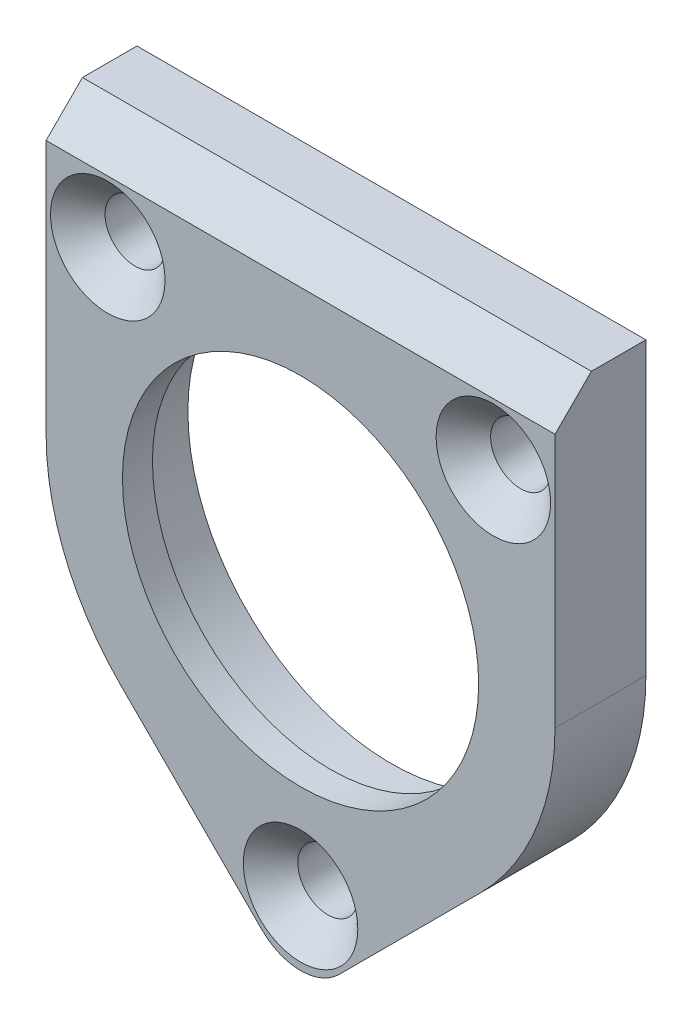
ISO-10303-21;
HEADER;
FILE_DESCRIPTION(('STEP AP214'),'2;1');
FILE_NAME('part.step','',(''),(''),'','','');
FILE_SCHEMA(('AUTOMOTIVE_DESIGN { 1 0 10303 214 1 1 1 1 }'));
ENDSEC;
DATA;
#1=APPLICATION_CONTEXT('core data for automotive mechanical design processes');
#2=APPLICATION_PROTOCOL_DEFINITION('international standard','automotive_design',2000,#1);
#3=PRODUCT_CONTEXT('',#1,'mechanical');
#4=PRODUCT('Part','Part','',(#3));
#5=PRODUCT_RELATED_PRODUCT_CATEGORY('part','',(#4));
#6=PRODUCT_DEFINITION_FORMATION('','',#4);
#7=PRODUCT_DEFINITION_CONTEXT('part definition',#1,'design');
#8=PRODUCT_DEFINITION('design','',#6,#7);
#9=PRODUCT_DEFINITION_SHAPE('','',#8);
#10=(LENGTH_UNIT() NAMED_UNIT(*) SI_UNIT(.MILLI.,.METRE.));
#11=(NAMED_UNIT(*) PLANE_ANGLE_UNIT() SI_UNIT($,.RADIAN.));
#12=(NAMED_UNIT(*) SI_UNIT($,.STERADIAN.) SOLID_ANGLE_UNIT());
#13=UNCERTAINTY_MEASURE_WITH_UNIT(LENGTH_MEASURE(1.E-05),#10,'distance_accuracy_value','');
#14=(GEOMETRIC_REPRESENTATION_CONTEXT(3) GLOBAL_UNCERTAINTY_ASSIGNED_CONTEXT((#13)) GLOBAL_UNIT_ASSIGNED_CONTEXT((#10,
#11,#12)) REPRESENTATION_CONTEXT('',''));
#15=CARTESIAN_POINT('',(0.,0.,0.));
#16=DIRECTION('',(0.,0.,1.));
#17=DIRECTION('',(1.,0.,0.));
#18=AXIS2_PLACEMENT_3D('',#15,#16,#17);
#19=CARTESIAN_POINT('',(-14.,14.,-5.));
#20=DIRECTION('',(-1.,0.,0.));
#21=DIRECTION('',(0.,0.,1.));
#22=AXIS2_PLACEMENT_3D('',#19,#20,#21);
#23=PLANE('',#22);
#24=DIRECTION('',(0.,-1.,0.));
#25=VECTOR('',#24,1.);
#26=CARTESIAN_POINT('',(-14.,14.,0.));
#27=LINE('',#26,#25);
#28=CARTESIAN_POINT('',(-14.,14.,0.));
#29=VERTEX_POINT('',#28);
#30=CARTESIAN_POINT('',(-14.,0.,0.));
#31=VERTEX_POINT('',#30);
#32=EDGE_CURVE('E150',#29,#31,#27,.T.);
#33=ORIENTED_EDGE('',*,*,#32,.F.);
#34=DIRECTION('',(0.,-0.707106781186547,0.707106781186548));
#35=VECTOR('',#34,1.);
#36=CARTESIAN_POINT('',(-14.,16.,-2.));
#37=LINE('',#36,#35);
#38=CARTESIAN_POINT('',(-14.,16.,-2.));
#39=VERTEX_POINT('',#38);
#40=EDGE_CURVE('E358',#39,#29,#37,.T.);
#41=ORIENTED_EDGE('',*,*,#40,.F.);
#42=DIRECTION('',(0.,0.,1.));
#43=VECTOR('',#42,1.);
#44=CARTESIAN_POINT('',(-14.,16.,-5.));
#45=LINE('',#44,#43);
#46=CARTESIAN_POINT('',(-14.,16.,-5.));
#47=VERTEX_POINT('',#46);
#48=EDGE_CURVE('E355',#47,#39,#45,.T.);
#49=ORIENTED_EDGE('',*,*,#48,.F.);
#50=DIRECTION('',(0.,-1.,0.));
#51=VECTOR('',#50,1.);
#52=CARTESIAN_POINT('',(-14.,14.,-5.));
#53=LINE('',#52,#51);
#54=CARTESIAN_POINT('',(-14.,0.,-5.));
#55=VERTEX_POINT('',#54);
#56=EDGE_CURVE('E167',#47,#55,#53,.T.);
#57=ORIENTED_EDGE('',*,*,#56,.T.);
#58=DIRECTION('',(0.,0.,1.));
#59=VECTOR('',#58,1.);
#60=CARTESIAN_POINT('',(-14.,0.,-5.));
#61=LINE('',#60,#59);
#62=EDGE_CURVE('E104',#55,#31,#61,.T.);
#63=ORIENTED_EDGE('',*,*,#62,.T.);
#64=EDGE_LOOP('',(#33,#41,#49,#57,#63));
#65=FACE_BOUND('',#64,.T.);
#66=ADVANCED_FACE('F47',(#65),#23,.T.);
#67=CARTESIAN_POINT('',(14.,14.,-5.));
#68=DIRECTION('',(1.,0.,0.));
#69=DIRECTION('',(0.,0.,-1.));
#70=AXIS2_PLACEMENT_3D('',#67,#68,#69);
#71=PLANE('',#70);
#72=DIRECTION('',(0.,1.,0.));
#73=VECTOR('',#72,1.);
#74=CARTESIAN_POINT('',(14.,14.,0.));
#75=LINE('',#74,#73);
#76=CARTESIAN_POINT('',(14.,0.,0.));
#77=VERTEX_POINT('',#76);
#78=CARTESIAN_POINT('',(14.,14.,0.));
#79=VERTEX_POINT('',#78);
#80=EDGE_CURVE('E96',#77,#79,#75,.T.);
#81=ORIENTED_EDGE('',*,*,#80,.F.);
#82=DIRECTION('',(0.,0.,1.));
#83=VECTOR('',#82,1.);
#84=CARTESIAN_POINT('',(14.,0.,-5.));
#85=LINE('',#84,#83);
#86=CARTESIAN_POINT('',(14.,0.,-5.));
#87=VERTEX_POINT('',#86);
#88=EDGE_CURVE('E12',#87,#77,#85,.T.);
#89=ORIENTED_EDGE('',*,*,#88,.F.);
#90=DIRECTION('',(0.,1.,0.));
#91=VECTOR('',#90,1.);
#92=CARTESIAN_POINT('',(14.,14.,-5.));
#93=LINE('',#92,#91);
#94=CARTESIAN_POINT('',(14.,16.,-5.));
#95=VERTEX_POINT('',#94);
#96=EDGE_CURVE('E148',#87,#95,#93,.T.);
#97=ORIENTED_EDGE('',*,*,#96,.T.);
#98=DIRECTION('',(0.,0.,1.));
#99=VECTOR('',#98,1.);
#100=CARTESIAN_POINT('',(14.,16.,-5.));
#101=LINE('',#100,#99);
#102=CARTESIAN_POINT('',(14.,16.,-2.));
#103=VERTEX_POINT('',#102);
#104=EDGE_CURVE('E340',#95,#103,#101,.T.);
#105=ORIENTED_EDGE('',*,*,#104,.T.);
#106=DIRECTION('',(0.,-0.707106781186547,0.707106781186548));
#107=VECTOR('',#106,1.);
#108=CARTESIAN_POINT('',(14.,16.,-2.));
#109=LINE('',#108,#107);
#110=EDGE_CURVE('E362',#103,#79,#109,.T.);
#111=ORIENTED_EDGE('',*,*,#110,.T.);
#112=EDGE_LOOP('',(#81,#89,#97,#105,#111));
#113=FACE_BOUND('',#112,.T.);
#114=ADVANCED_FACE('F198',(#113),#71,.T.);
#115=CARTESIAN_POINT('',(0.,0.,-5.));
#116=DIRECTION('',(0.,0.,1.));
#117=DIRECTION('',(1.,0.,0.));
#118=AXIS2_PLACEMENT_3D('',#115,#116,#117);
#119=CYLINDRICAL_SURFACE('',#118,14.);
#120=CARTESIAN_POINT('',(0.,0.,0.));
#121=DIRECTION('',(0.,0.,1.));
#122=DIRECTION('',(1.,0.,0.));
#123=AXIS2_PLACEMENT_3D('',#120,#121,#122);
#124=CIRCLE('',#123,14.);
#125=CARTESIAN_POINT('',(9.89949493661166,-9.89949493661167,0.));
#126=VERTEX_POINT('',#125);
#127=EDGE_CURVE('E163',#126,#77,#124,.T.);
#128=ORIENTED_EDGE('',*,*,#127,.F.);
#129=DIRECTION('',(0.,0.,1.));
#130=VECTOR('',#129,1.);
#131=CARTESIAN_POINT('',(9.89949493661166,-9.89949493661167,-5.));
#132=LINE('',#131,#130);
#133=CARTESIAN_POINT('',(9.89949493661166,-9.89949493661167,-5.));
#134=VERTEX_POINT('',#133);
#135=EDGE_CURVE('E58',#134,#126,#132,.T.);
#136=ORIENTED_EDGE('',*,*,#135,.F.);
#137=CARTESIAN_POINT('',(0.,0.,-5.));
#138=DIRECTION('',(0.,0.,1.));
#139=DIRECTION('',(1.,0.,0.));
#140=AXIS2_PLACEMENT_3D('',#137,#138,#139);
#141=CIRCLE('',#140,14.);
#142=EDGE_CURVE('E138',#134,#87,#141,.T.);
#143=ORIENTED_EDGE('',*,*,#142,.T.);
#144=ORIENTED_EDGE('',*,*,#88,.T.);
#145=EDGE_LOOP('',(#128,#136,#143,#144));
#146=FACE_BOUND('',#145,.T.);
#147=ADVANCED_FACE('F399',(#146),#119,.T.);
#148=CARTESIAN_POINT('',(9.89949493661167,-9.89949493661167,-5.));
#149=DIRECTION('',(0.707106781186548,-0.707106781186548,0.));
#150=DIRECTION('',(0.707106781186548,0.707106781186548,0.));
#151=AXIS2_PLACEMENT_3D('',#148,#149,#150);
#152=PLANE('',#151);
#153=DIRECTION('',(0.707106781186548,0.707106781186548,0.));
#154=VECTOR('',#153,1.);
#155=CARTESIAN_POINT('',(9.89949493661167,-9.89949493661167,0.));
#156=LINE('',#155,#154);
#157=CARTESIAN_POINT('',(2.12189296525723,-17.6770969079661,0.));
#158=VERTEX_POINT('',#157);
#159=EDGE_CURVE('E123',#158,#126,#156,.T.);
#160=ORIENTED_EDGE('',*,*,#159,.F.);
#161=DIRECTION('',(0.,0.,1.));
#162=VECTOR('',#161,1.);
#163=CARTESIAN_POINT('',(2.12189296525723,-17.6770969079661,-5.));
#164=LINE('',#163,#162);
#165=CARTESIAN_POINT('',(2.12189296525723,-17.6770969079661,-5.));
#166=VERTEX_POINT('',#165);
#167=EDGE_CURVE('E118',#166,#158,#164,.T.);
#168=ORIENTED_EDGE('',*,*,#167,.F.);
#169=DIRECTION('',(0.707106781186548,0.707106781186548,0.));
#170=VECTOR('',#169,1.);
#171=CARTESIAN_POINT('',(9.89949493661167,-9.89949493661167,-5.));
#172=LINE('',#171,#170);
#173=EDGE_CURVE('E121',#166,#134,#172,.T.);
#174=ORIENTED_EDGE('',*,*,#173,.T.);
#175=ORIENTED_EDGE('',*,*,#135,.T.);
#176=EDGE_LOOP('',(#160,#168,#174,#175));
#177=FACE_BOUND('',#176,.T.);
#178=ADVANCED_FACE('F120',(#177),#152,.T.);
#179=CARTESIAN_POINT('',(0.,-15.5557765644039,-5.));
#180=DIRECTION('',(0.,0.,1.));
#181=DIRECTION('',(1.,0.,0.));
#182=AXIS2_PLACEMENT_3D('',#179,#180,#181);
#183=CYLINDRICAL_SURFACE('',#182,3.00040493200821);
#184=CARTESIAN_POINT('',(0.,-15.5557765644039,0.));
#185=DIRECTION('',(0.,0.,1.));
#186=DIRECTION('',(1.,0.,0.));
#187=AXIS2_PLACEMENT_3D('',#184,#185,#186);
#188=CIRCLE('',#187,3.00040493200821);
#189=CARTESIAN_POINT('',(-2.12132034355964,-17.6776695296637,0.));
#190=VERTEX_POINT('',#189);
#191=EDGE_CURVE('E160',#190,#158,#188,.T.);
#192=ORIENTED_EDGE('',*,*,#191,.F.);
#193=DIRECTION('',(0.,0.,1.));
#194=VECTOR('',#193,1.);
#195=CARTESIAN_POINT('',(-2.12132034355964,-17.6776695296637,-5.));
#196=LINE('',#195,#194);
#197=CARTESIAN_POINT('',(-2.12132034355964,-17.6776695296637,-5.));
#198=VERTEX_POINT('',#197);
#199=EDGE_CURVE('E128',#198,#190,#196,.T.);
#200=ORIENTED_EDGE('',*,*,#199,.F.);
#201=CARTESIAN_POINT('',(0.,-15.5557765644039,-5.));
#202=DIRECTION('',(0.,0.,1.));
#203=DIRECTION('',(1.,0.,0.));
#204=AXIS2_PLACEMENT_3D('',#201,#202,#203);
#205=CIRCLE('',#204,3.00040493200821);
#206=EDGE_CURVE('E136',#198,#166,#205,.T.);
#207=ORIENTED_EDGE('',*,*,#206,.T.);
#208=ORIENTED_EDGE('',*,*,#167,.T.);
#209=EDGE_LOOP('',(#192,#200,#207,#208));
#210=FACE_BOUND('',#209,.T.);
#211=ADVANCED_FACE('F140',(#210),#183,.T.);
#212=CARTESIAN_POINT('',(-9.89949493661166,-9.89949493661167,-5.));
#213=DIRECTION('',(-0.707106781186548,-0.707106781186548,0.));
#214=DIRECTION('',(0.707106781186548,-0.707106781186548,0.));
#215=AXIS2_PLACEMENT_3D('',#212,#213,#214);
#216=PLANE('',#215);
#217=DIRECTION('',(0.707106781186548,-0.707106781186548,0.));
#218=VECTOR('',#217,1.);
#219=CARTESIAN_POINT('',(-9.89949493661166,-9.89949493661167,0.));
#220=LINE('',#219,#218);
#221=CARTESIAN_POINT('',(-9.89949493661166,-9.89949493661167,0.));
#222=VERTEX_POINT('',#221);
#223=EDGE_CURVE('E157',#222,#190,#220,.T.);
#224=ORIENTED_EDGE('',*,*,#223,.F.);
#225=DIRECTION('',(0.,0.,1.));
#226=VECTOR('',#225,1.);
#227=CARTESIAN_POINT('',(-9.89949493661166,-9.89949493661167,-5.));
#228=LINE('',#227,#226);
#229=CARTESIAN_POINT('',(-9.89949493661166,-9.89949493661167,-5.));
#230=VERTEX_POINT('',#229);
#231=EDGE_CURVE('E171',#230,#222,#228,.T.);
#232=ORIENTED_EDGE('',*,*,#231,.F.);
#233=DIRECTION('',(0.707106781186548,-0.707106781186548,0.));
#234=VECTOR('',#233,1.);
#235=CARTESIAN_POINT('',(-9.89949493661166,-9.89949493661167,-5.));
#236=LINE('',#235,#234);
#237=EDGE_CURVE('E141',#230,#198,#236,.T.);
#238=ORIENTED_EDGE('',*,*,#237,.T.);
#239=ORIENTED_EDGE('',*,*,#199,.T.);
#240=EDGE_LOOP('',(#224,#232,#238,#239));
#241=FACE_BOUND('',#240,.T.);
#242=ADVANCED_FACE('F405',(#241),#216,.T.);
#243=CARTESIAN_POINT('',(0.,0.,-5.));
#244=DIRECTION('',(0.,0.,1.));
#245=DIRECTION('',(1.,0.,0.));
#246=AXIS2_PLACEMENT_3D('',#243,#244,#245);
#247=CYLINDRICAL_SURFACE('',#246,14.);
#248=CARTESIAN_POINT('',(0.,0.,0.));
#249=DIRECTION('',(0.,0.,1.));
#250=DIRECTION('',(-1.,0.,0.));
#251=AXIS2_PLACEMENT_3D('',#248,#249,#250);
#252=CIRCLE('',#251,14.);
#253=EDGE_CURVE('E153',#31,#222,#252,.T.);
#254=ORIENTED_EDGE('',*,*,#253,.F.);
#255=ORIENTED_EDGE('',*,*,#62,.F.);
#256=CARTESIAN_POINT('',(0.,0.,-5.));
#257=DIRECTION('',(0.,0.,1.));
#258=DIRECTION('',(-1.,0.,0.));
#259=AXIS2_PLACEMENT_3D('',#256,#257,#258);
#260=CIRCLE('',#259,14.);
#261=EDGE_CURVE('E143',#55,#230,#260,.T.);
#262=ORIENTED_EDGE('',*,*,#261,.T.);
#263=ORIENTED_EDGE('',*,*,#231,.T.);
#264=EDGE_LOOP('',(#254,#255,#262,#263));
#265=FACE_BOUND('',#264,.T.);
#266=ADVANCED_FACE('F345',(#265),#247,.T.);
#267=CARTESIAN_POINT('',(0.,0.,-5.));
#268=DIRECTION('',(0.,0.,-1.));
#269=DIRECTION('',(-1.,0.,0.));
#270=AXIS2_PLACEMENT_3D('',#267,#268,#269);
#271=PLANE('',#270);
#272=CARTESIAN_POINT('',(0.,0.,-5.));
#273=DIRECTION('',(0.,0.,-1.));
#274=DIRECTION('',(-1.,0.,0.));
#275=AXIS2_PLACEMENT_3D('',#272,#273,#274);
#276=CIRCLE('',#275,11.19888);
#277=CARTESIAN_POINT('',(-11.19888,0.,-5.));
#278=VERTEX_POINT('',#277);
#279=EDGE_CURVE('E369',#278,#278,#276,.T.);
#280=ORIENTED_EDGE('',*,*,#279,.F.);
#281=EDGE_LOOP('',(#280));
#282=FACE_BOUND('',#281,.T.);
#283=CARTESIAN_POINT('',(-10.6066,10.6066034355961,-5.));
#284=DIRECTION('',(0.,0.,-1.));
#285=DIRECTION('',(-1.,0.,0.));
#286=AXIS2_PLACEMENT_3D('',#283,#284,#285);
#287=CIRCLE('',#286,1.648905);
#288=CARTESIAN_POINT('',(-12.255505,10.6066034355961,-5.));
#289=VERTEX_POINT('',#288);
#290=EDGE_CURVE('E229',#289,#289,#287,.T.);
#291=ORIENTED_EDGE('',*,*,#290,.F.);
#292=EDGE_LOOP('',(#291));
#293=FACE_BOUND('',#292,.T.);
#294=CARTESIAN_POINT('',(10.6066,10.6066034355961,-5.));
#295=DIRECTION('',(0.,0.,-1.));
#296=DIRECTION('',(-1.,0.,0.));
#297=AXIS2_PLACEMENT_3D('',#294,#295,#296);
#298=CIRCLE('',#297,1.648905);
#299=CARTESIAN_POINT('',(8.957695,10.6066034355961,-5.));
#300=VERTEX_POINT('',#299);
#301=EDGE_CURVE('E225',#300,#300,#298,.T.);
#302=ORIENTED_EDGE('',*,*,#301,.F.);
#303=EDGE_LOOP('',(#302));
#304=FACE_BOUND('',#303,.T.);
#305=CARTESIAN_POINT('',(0.,-14.9999965644039,-5.));
#306=DIRECTION('',(0.,0.,-1.));
#307=DIRECTION('',(-1.,0.,0.));
#308=AXIS2_PLACEMENT_3D('',#305,#306,#307);
#309=CIRCLE('',#308,1.65);
#310=CARTESIAN_POINT('',(-1.65,-14.9999965644039,-5.));
#311=VERTEX_POINT('',#310);
#312=EDGE_CURVE('E217',#311,#311,#309,.T.);
#313=ORIENTED_EDGE('',*,*,#312,.F.);
#314=EDGE_LOOP('',(#313));
#315=FACE_BOUND('',#314,.T.);
#316=ORIENTED_EDGE('',*,*,#56,.F.);
#317=DIRECTION('',(1.,0.,0.));
#318=VECTOR('',#317,1.);
#319=CARTESIAN_POINT('',(-14.,16.,-5.));
#320=LINE('',#319,#318);
#321=EDGE_CURVE('E364',#47,#95,#320,.T.);
#322=ORIENTED_EDGE('',*,*,#321,.T.);
#323=ORIENTED_EDGE('',*,*,#96,.F.);
#324=ORIENTED_EDGE('',*,*,#142,.F.);
#325=ORIENTED_EDGE('',*,*,#173,.F.);
#326=ORIENTED_EDGE('',*,*,#206,.F.);
#327=ORIENTED_EDGE('',*,*,#237,.F.);
#328=ORIENTED_EDGE('',*,*,#261,.F.);
#329=EDGE_LOOP('',(#316,#322,#323,#324,#325,#326,#327,#328));
#330=FACE_BOUND('',#329,.T.);
#331=ADVANCED_FACE('F134',(#282,#293,#304,#315,#330),#271,.T.);
#332=CARTESIAN_POINT('',(0.,0.,0.));
#333=DIRECTION('',(0.,0.,-1.));
#334=DIRECTION('',(-1.,0.,0.));
#335=AXIS2_PLACEMENT_3D('',#332,#333,#334);
#336=PLANE('',#335);
#337=CARTESIAN_POINT('',(0.,-14.9999965644039,0.));
#338=DIRECTION('',(0.,0.,1.));
#339=DIRECTION('',(1.,0.,0.));
#340=AXIS2_PLACEMENT_3D('',#337,#338,#339);
#341=CIRCLE('',#340,3.15);
#342=CARTESIAN_POINT('',(3.15000000000001,-14.9999965644039,0.));
#343=VERTEX_POINT('',#342);
#344=EDGE_CURVE('E213',#343,#343,#341,.T.);
#345=ORIENTED_EDGE('',*,*,#344,.F.);
#346=EDGE_LOOP('',(#345));
#347=FACE_BOUND('',#346,.T.);
#348=CARTESIAN_POINT('',(-10.6066,10.6066034355961,0.));
#349=DIRECTION('',(0.,0.,1.));
#350=DIRECTION('',(1.,0.,0.));
#351=AXIS2_PLACEMENT_3D('',#348,#349,#350);
#352=CIRCLE('',#351,3.14999999999999);
#353=CARTESIAN_POINT('',(-7.45660000000001,10.6066034355961,0.));
#354=VERTEX_POINT('',#353);
#355=EDGE_CURVE('E282',#354,#354,#352,.T.);
#356=ORIENTED_EDGE('',*,*,#355,.F.);
#357=EDGE_LOOP('',(#356));
#358=FACE_BOUND('',#357,.T.);
#359=CARTESIAN_POINT('',(10.6066,10.6066034355961,0.));
#360=DIRECTION('',(0.,0.,-1.));
#361=DIRECTION('',(-1.,0.,0.));
#362=AXIS2_PLACEMENT_3D('',#359,#360,#361);
#363=CIRCLE('',#362,3.14999999999999);
#364=CARTESIAN_POINT('',(7.45660000000001,10.6066034355961,0.));
#365=VERTEX_POINT('',#364);
#366=EDGE_CURVE('E178',#365,#365,#363,.T.);
#367=ORIENTED_EDGE('',*,*,#366,.T.);
#368=EDGE_LOOP('',(#367));
#369=FACE_BOUND('',#368,.T.);
#370=CARTESIAN_POINT('',(0.,0.,0.));
#371=DIRECTION('',(0.,0.,1.));
#372=DIRECTION('',(1.,0.,0.));
#373=AXIS2_PLACEMENT_3D('',#370,#371,#372);
#374=CIRCLE('',#373,9.79888);
#375=CARTESIAN_POINT('',(9.79888,0.,0.));
#376=VERTEX_POINT('',#375);
#377=EDGE_CURVE('E154',#376,#376,#374,.T.);
#378=ORIENTED_EDGE('',*,*,#377,.F.);
#379=EDGE_LOOP('',(#378));
#380=FACE_BOUND('',#379,.T.);
#381=ORIENTED_EDGE('',*,*,#32,.T.);
#382=ORIENTED_EDGE('',*,*,#253,.T.);
#383=ORIENTED_EDGE('',*,*,#223,.T.);
#384=ORIENTED_EDGE('',*,*,#191,.T.);
#385=ORIENTED_EDGE('',*,*,#159,.T.);
#386=ORIENTED_EDGE('',*,*,#127,.T.);
#387=ORIENTED_EDGE('',*,*,#80,.T.);
#388=DIRECTION('',(-1.,0.,0.));
#389=VECTOR('',#388,1.);
#390=CARTESIAN_POINT('',(14.,14.,0.));
#391=LINE('',#390,#389);
#392=EDGE_CURVE('E166',#79,#29,#391,.T.);
#393=ORIENTED_EDGE('',*,*,#392,.T.);
#394=EDGE_LOOP('',(#381,#382,#383,#384,#385,#386,#387,#393));
#395=FACE_BOUND('',#394,.T.);
#396=ADVANCED_FACE('F185',(#347,#358,#369,#380,#395),#336,.F.);
#397=CARTESIAN_POINT('',(0.,0.,-1.65));
#398=DIRECTION('',(0.,0.,1.));
#399=DIRECTION('',(1.,0.,0.));
#400=AXIS2_PLACEMENT_3D('',#397,#398,#399);
#401=CYLINDRICAL_SURFACE('',#400,9.79888);
#402=CARTESIAN_POINT('',(0.,0.,-1.65));
#403=DIRECTION('',(0.,0.,1.));
#404=DIRECTION('',(1.,0.,0.));
#405=AXIS2_PLACEMENT_3D('',#402,#403,#404);
#406=CIRCLE('',#405,9.79888);
#407=CARTESIAN_POINT('',(9.79888,0.,-1.65));
#408=VERTEX_POINT('',#407);
#409=EDGE_CURVE('E337',#408,#408,#406,.T.);
#410=ORIENTED_EDGE('',*,*,#409,.F.);
#411=EDGE_LOOP('',(#410));
#412=FACE_BOUND('',#411,.T.);
#413=ORIENTED_EDGE('',*,*,#377,.T.);
#414=EDGE_LOOP('',(#413));
#415=FACE_BOUND('',#414,.T.);
#416=ADVANCED_FACE('F195',(#412,#415),#401,.F.);
#417=CARTESIAN_POINT('',(10.6066,10.6066034355961,-1.5));
#418=DIRECTION('',(0.,0.,1.));
#419=DIRECTION('',(1.,0.,0.));
#420=AXIS2_PLACEMENT_3D('',#417,#418,#419);
#421=CONICAL_SURFACE('',#420,1.648905,0.785763030204862);
#422=ORIENTED_EDGE('',*,*,#366,.F.);
#423=EDGE_LOOP('',(#422));
#424=FACE_BOUND('',#423,.T.);
#425=CARTESIAN_POINT('',(10.6066,10.6066034355961,-1.5));
#426=DIRECTION('',(0.,0.,1.));
#427=DIRECTION('',(1.,0.,0.));
#428=AXIS2_PLACEMENT_3D('',#425,#426,#427);
#429=CIRCLE('',#428,1.648905);
#430=CARTESIAN_POINT('',(12.255505,10.6066034355961,-1.5));
#431=VERTEX_POINT('',#430);
#432=EDGE_CURVE('E377',#431,#431,#429,.T.);
#433=ORIENTED_EDGE('',*,*,#432,.F.);
#434=EDGE_LOOP('',(#433));
#435=FACE_BOUND('',#434,.T.);
#436=ADVANCED_FACE('F317',(#424,#435),#421,.F.);
#437=CARTESIAN_POINT('',(-8.05819646771892,12.4581269803174,0.));
#438=CARTESIAN_POINT('',(-9.51849292426859,11.8455185621356,-1.5));
#439=CARTESIAN_POINT('',(-4.35514937827635,7.36131991575528,0.));
#440=CARTESIAN_POINT('',(-7.0406626711897,9.66930441067278,-1.5));
#441=CARTESIAN_POINT('',(-9.45195644283851,3.65827282631271,0.));
#442=CARTESIAN_POINT('',(-9.21687682265252,7.19147415759388,-1.5));
#443=CARTESIAN_POINT('',(-13.1550035322811,8.75507989087486,0.));
#444=CARTESIAN_POINT('',(-11.6947070757314,9.3676883090567,-1.5));
#445=CARTESIAN_POINT('',(-16.8580506217237,13.851886955437,0.));
#446=CARTESIAN_POINT('',(-14.1725373288103,11.5439024605195,-1.5));
#447=CARTESIAN_POINT('',(-11.7612435571615,17.5549340448796,0.));
#448=CARTESIAN_POINT('',(-11.9963231773475,14.0217327135984,-1.5));
#449=CARTESIAN_POINT('',(-8.05819646771892,12.4581269803174,0.));
#450=CARTESIAN_POINT('',(-9.51849292426859,11.8455185621356,-1.5));
#451=(BOUNDED_SURFACE() B_SPLINE_SURFACE(3,1,((#437,#438),(#439,#440),(#441,#442),(#443,#444),
(#445,#446),(#447,#448),(#449,#450)),.UNSPECIFIED.,.T.,.F.,.F.) B_SPLINE_SURFACE_WITH_KNOTS((4,
3,4),(2,2),(0.,0.5,1.),(0.,1.),
.UNSPECIFIED.) GEOMETRIC_REPRESENTATION_ITEM() RATIONAL_B_SPLINE_SURFACE(((1.,1.),
(0.333333333333333,0.333333333333333),(0.333333333333333,0.333333333333333),(1.,1.),
(0.333333333333333,0.333333333333333),(0.333333333333333,0.333333333333333),(1.,1.))) REPRESENTATION_ITEM('') SURFACE());
#452=CARTESIAN_POINT('',(-9.51849292426842,11.8455185621357,-1.49999999999982));
#453=CARTESIAN_POINT('',(-7.04066267118938,9.6693044106725,-1.49999999999982));
#454=CARTESIAN_POINT('',(-9.21687682265255,7.19147415759346,-1.49999999999982));
#455=CARTESIAN_POINT('',(-11.6947070757316,9.36768830905663,-1.49999999999982));
#456=CARTESIAN_POINT('',(-14.1725373288106,11.5439024605198,-1.49999999999982));
#457=CARTESIAN_POINT('',(-11.9963231773475,14.0217327135988,-1.49999999999982));
#458=CARTESIAN_POINT('',(-9.51849292426842,11.8455185621357,-1.49999999999982));
#459=(BOUNDED_CURVE() B_SPLINE_CURVE(3,(#452,#453,#454,#455,#456,#457,#458),.UNSPECIFIED.,.T.,
.F.) B_SPLINE_CURVE_WITH_KNOTS((4,3,4),(0.,0.5,1.),
.UNSPECIFIED.) CURVE() GEOMETRIC_REPRESENTATION_ITEM() RATIONAL_B_SPLINE_CURVE((1.,
0.333333333333333,0.333333333333333,1.,0.333333333333333,0.333333333333333,1.)) REPRESENTATION_ITEM(''));
#460=CARTESIAN_POINT('',(-9.51849292426842,11.8455185621357,-1.49999999999982));
#461=VERTEX_POINT('',#460);
#462=EDGE_CURVE('E226',#461,#461,#459,.F.);
#463=ORIENTED_EDGE('',*,*,#355,.T.);
#464=EDGE_LOOP('',(#463));
#465=FACE_BOUND('',#464,.T.);
#466=ORIENTED_EDGE('',*,*,#462,.F.);
#467=EDGE_LOOP('',(#466));
#468=FACE_BOUND('',#467,.T.);
#469=ADVANCED_FACE('F260',(#465,#468),#451,.F.);
#470=CARTESIAN_POINT('',(0.,-14.9999965644039,-1.5));
#471=DIRECTION('',(0.,0.,1.));
#472=DIRECTION('',(1.,0.,0.));
#473=AXIS2_PLACEMENT_3D('',#470,#471,#472);
#474=CONICAL_SURFACE('',#473,1.65,0.785398163397448);
#475=ORIENTED_EDGE('',*,*,#344,.T.);
#476=EDGE_LOOP('',(#475));
#477=FACE_BOUND('',#476,.T.);
#478=CARTESIAN_POINT('',(0.,-14.9999965644039,-1.5));
#479=DIRECTION('',(0.,0.,1.));
#480=DIRECTION('',(1.,0.,0.));
#481=AXIS2_PLACEMENT_3D('',#478,#479,#480);
#482=CIRCLE('',#481,1.65);
#483=CARTESIAN_POINT('',(1.65000000000001,-14.9999965644039,-1.5));
#484=VERTEX_POINT('',#483);
#485=EDGE_CURVE('E236',#484,#484,#482,.T.);
#486=ORIENTED_EDGE('',*,*,#485,.F.);
#487=EDGE_LOOP('',(#486));
#488=FACE_BOUND('',#487,.T.);
#489=ADVANCED_FACE('F253',(#477,#488),#474,.F.);
#490=CARTESIAN_POINT('',(0.,-14.9999965644039,-6.5));
#491=DIRECTION('',(0.,0.,1.));
#492=DIRECTION('',(1.,0.,0.));
#493=AXIS2_PLACEMENT_3D('',#490,#491,#492);
#494=CYLINDRICAL_SURFACE('',#493,1.65);
#495=ORIENTED_EDGE('',*,*,#312,.T.);
#496=EDGE_LOOP('',(#495));
#497=FACE_BOUND('',#496,.T.);
#498=ORIENTED_EDGE('',*,*,#485,.T.);
#499=EDGE_LOOP('',(#498));
#500=FACE_BOUND('',#499,.T.);
#501=ADVANCED_FACE('F243',(#497,#500),#494,.F.);
#502=CARTESIAN_POINT('',(10.6066,10.6066034355961,-6.5));
#503=DIRECTION('',(0.,0.,1.));
#504=DIRECTION('',(1.,0.,0.));
#505=AXIS2_PLACEMENT_3D('',#502,#503,#504);
#506=CYLINDRICAL_SURFACE('',#505,1.648905);
#507=ORIENTED_EDGE('',*,*,#301,.T.);
#508=EDGE_LOOP('',(#507));
#509=FACE_BOUND('',#508,.T.);
#510=ORIENTED_EDGE('',*,*,#432,.T.);
#511=EDGE_LOOP('',(#510));
#512=FACE_BOUND('',#511,.T.);
#513=ADVANCED_FACE('F252',(#509,#512),#506,.F.);
#514=CARTESIAN_POINT('',(-10.6066,10.6066034355961,-6.5));
#515=DIRECTION('',(0.,0.,1.));
#516=DIRECTION('',(1.,0.,0.));
#517=AXIS2_PLACEMENT_3D('',#514,#515,#516);
#518=CYLINDRICAL_SURFACE('',#517,1.648905);
#519=ORIENTED_EDGE('',*,*,#290,.T.);
#520=EDGE_LOOP('',(#519));
#521=FACE_BOUND('',#520,.T.);
#522=ORIENTED_EDGE('',*,*,#462,.T.);
#523=EDGE_LOOP('',(#522));
#524=FACE_BOUND('',#523,.T.);
#525=ADVANCED_FACE('F381',(#521,#524),#518,.F.);
#526=CARTESIAN_POINT('',(-14.,16.,-2.));
#527=DIRECTION('',(0.,0.707106781186548,0.707106781186547));
#528=DIRECTION('',(0.,-0.707106781186547,0.707106781186548));
#529=AXIS2_PLACEMENT_3D('',#526,#527,#528);
#530=PLANE('',#529);
#531=ORIENTED_EDGE('',*,*,#110,.F.);
#532=DIRECTION('',(1.,0.,0.));
#533=VECTOR('',#532,1.);
#534=CARTESIAN_POINT('',(-14.,16.,-2.));
#535=LINE('',#534,#533);
#536=EDGE_CURVE('E374',#39,#103,#535,.T.);
#537=ORIENTED_EDGE('',*,*,#536,.F.);
#538=ORIENTED_EDGE('',*,*,#40,.T.);
#539=ORIENTED_EDGE('',*,*,#392,.F.);
#540=EDGE_LOOP('',(#531,#537,#538,#539));
#541=FACE_BOUND('',#540,.T.);
#542=ADVANCED_FACE('F383',(#541),#530,.T.);
#543=CARTESIAN_POINT('',(-14.,16.,-5.));
#544=DIRECTION('',(0.,1.,0.));
#545=DIRECTION('',(0.,0.,1.));
#546=AXIS2_PLACEMENT_3D('',#543,#544,#545);
#547=PLANE('',#546);
#548=ORIENTED_EDGE('',*,*,#104,.F.);
#549=ORIENTED_EDGE('',*,*,#321,.F.);
#550=ORIENTED_EDGE('',*,*,#48,.T.);
#551=ORIENTED_EDGE('',*,*,#536,.T.);
#552=EDGE_LOOP('',(#548,#549,#550,#551));
#553=FACE_BOUND('',#552,.T.);
#554=ADVANCED_FACE('F390',(#553),#547,.T.);
#555=CARTESIAN_POINT('',(0.,0.,-1.65));
#556=DIRECTION('',(0.,0.,-1.));
#557=DIRECTION('',(-1.,0.,0.));
#558=AXIS2_PLACEMENT_3D('',#555,#556,#557);
#559=PLANE('',#558);
#560=CARTESIAN_POINT('',(0.,0.,-1.65));
#561=DIRECTION('',(0.,0.,-1.));
#562=DIRECTION('',(-1.,0.,0.));
#563=AXIS2_PLACEMENT_3D('',#560,#561,#562);
#564=CIRCLE('',#563,11.19888);
#565=CARTESIAN_POINT('',(-11.19888,0.,-1.65));
#566=VERTEX_POINT('',#565);
#567=EDGE_CURVE('E341',#566,#566,#564,.T.);
#568=ORIENTED_EDGE('',*,*,#567,.T.);
#569=EDGE_LOOP('',(#568));
#570=FACE_BOUND('',#569,.T.);
#571=ORIENTED_EDGE('',*,*,#409,.T.);
#572=EDGE_LOOP('',(#571));
#573=FACE_BOUND('',#572,.T.);
#574=ADVANCED_FACE('F526',(#570,#573),#559,.T.);
#575=CARTESIAN_POINT('',(0.,0.,-1.65));
#576=DIRECTION('',(0.,0.,-1.));
#577=DIRECTION('',(-1.,0.,0.));
#578=AXIS2_PLACEMENT_3D('',#575,#576,#577);
#579=CYLINDRICAL_SURFACE('',#578,11.19888);
#580=ORIENTED_EDGE('',*,*,#567,.F.);
#581=EDGE_LOOP('',(#580));
#582=FACE_BOUND('',#581,.T.);
#583=ORIENTED_EDGE('',*,*,#279,.T.);
#584=EDGE_LOOP('',(#583));
#585=FACE_BOUND('',#584,.T.);
#586=ADVANCED_FACE('F533',(#582,#585),#579,.F.);
#587=CLOSED_SHELL('',(#66,#114,#147,#178,#211,#242,#266,#331,#396,#416,#436,#469,#489,#501,#513,
#525,#542,#554,#574,#586));
#588=MANIFOLD_SOLID_BREP('B2',#587);
#589=ADVANCED_BREP_SHAPE_REPRESENTATION('',(#18,#588),#14);
#590=SHAPE_DEFINITION_REPRESENTATION(#9,#589);
ENDSEC;
END-ISO-10303-21;
